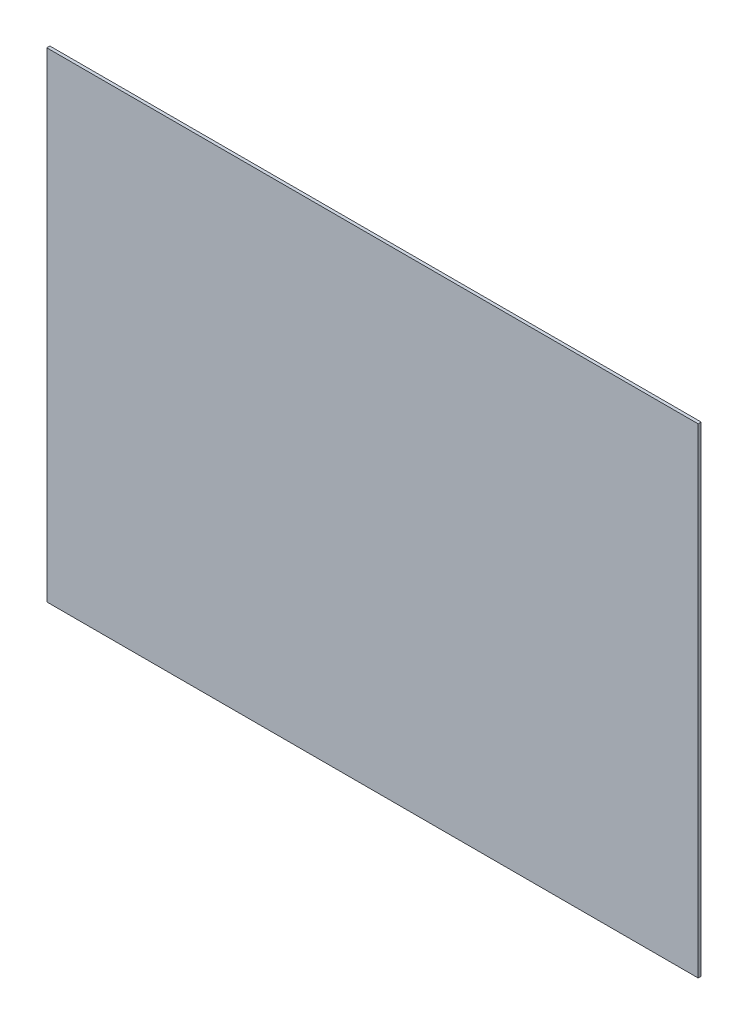
ISO-10303-21;
HEADER;
FILE_DESCRIPTION(('STEP AP214'),'2;1');
FILE_NAME('part.step','',(''),(''),'','','');
FILE_SCHEMA(('AUTOMOTIVE_DESIGN { 1 0 10303 214 1 1 1 1 }'));
ENDSEC;
DATA;
#1=APPLICATION_CONTEXT('core data for automotive mechanical design processes');
#2=APPLICATION_PROTOCOL_DEFINITION('international standard','automotive_design',2000,#1);
#3=PRODUCT_CONTEXT('',#1,'mechanical');
#4=PRODUCT('Part','Part','',(#3));
#5=PRODUCT_RELATED_PRODUCT_CATEGORY('part','',(#4));
#6=PRODUCT_DEFINITION_FORMATION('','',#4);
#7=PRODUCT_DEFINITION_CONTEXT('part definition',#1,'design');
#8=PRODUCT_DEFINITION('design','',#6,#7);
#9=PRODUCT_DEFINITION_SHAPE('','',#8);
#10=(LENGTH_UNIT() NAMED_UNIT(*) SI_UNIT(.MILLI.,.METRE.));
#11=(NAMED_UNIT(*) PLANE_ANGLE_UNIT() SI_UNIT($,.RADIAN.));
#12=(NAMED_UNIT(*) SI_UNIT($,.STERADIAN.) SOLID_ANGLE_UNIT());
#13=UNCERTAINTY_MEASURE_WITH_UNIT(LENGTH_MEASURE(1.E-05),#10,'distance_accuracy_value','');
#14=(GEOMETRIC_REPRESENTATION_CONTEXT(3) GLOBAL_UNCERTAINTY_ASSIGNED_CONTEXT((#13)) GLOBAL_UNIT_ASSIGNED_CONTEXT((#10,
#11,#12)) REPRESENTATION_CONTEXT('',''));
#15=CARTESIAN_POINT('',(0.,0.,0.));
#16=DIRECTION('',(0.,0.,1.));
#17=DIRECTION('',(1.,0.,0.));
#18=AXIS2_PLACEMENT_3D('',#15,#16,#17);
#19=CARTESIAN_POINT('',(1900.,-1400.,18.));
#20=DIRECTION('',(-1.,0.,0.));
#21=DIRECTION('',(0.,0.,1.));
#22=AXIS2_PLACEMENT_3D('',#19,#20,#21);
#23=PLANE('',#22);
#24=DIRECTION('',(0.,1.,0.));
#25=VECTOR('',#24,1.);
#26=CARTESIAN_POINT('',(1900.,-1400.,0.));
#27=LINE('',#26,#25);
#28=CARTESIAN_POINT('',(1900.,-1400.,0.));
#29=VERTEX_POINT('',#28);
#30=CARTESIAN_POINT('',(1900.,1400.,0.));
#31=VERTEX_POINT('',#30);
#32=EDGE_CURVE('E100',#29,#31,#27,.T.);
#33=ORIENTED_EDGE('',*,*,#32,.T.);
#34=DIRECTION('',(0.,0.,-1.));
#35=VECTOR('',#34,1.);
#36=CARTESIAN_POINT('',(1900.,1400.,18.));
#37=LINE('',#36,#35);
#38=CARTESIAN_POINT('',(1900.,1400.,18.));
#39=VERTEX_POINT('',#38);
#40=EDGE_CURVE('E11',#39,#31,#37,.T.);
#41=ORIENTED_EDGE('',*,*,#40,.F.);
#42=DIRECTION('',(0.,1.,0.));
#43=VECTOR('',#42,1.);
#44=CARTESIAN_POINT('',(1900.,-1400.,18.));
#45=LINE('',#44,#43);
#46=CARTESIAN_POINT('',(1900.,-1400.,18.));
#47=VERTEX_POINT('',#46);
#48=EDGE_CURVE('E88',#47,#39,#45,.T.);
#49=ORIENTED_EDGE('',*,*,#48,.F.);
#50=DIRECTION('',(0.,0.,-1.));
#51=VECTOR('',#50,1.);
#52=CARTESIAN_POINT('',(1900.,-1400.,18.));
#53=LINE('',#52,#51);
#54=EDGE_CURVE('E96',#47,#29,#53,.T.);
#55=ORIENTED_EDGE('',*,*,#54,.T.);
#56=EDGE_LOOP('',(#33,#41,#49,#55));
#57=FACE_BOUND('',#56,.T.);
#58=ADVANCED_FACE('F37',(#57),#23,.F.);
#59=CARTESIAN_POINT('',(-1900.,1400.,18.));
#60=DIRECTION('',(0.,-1.,0.));
#61=DIRECTION('',(0.,0.,-1.));
#62=AXIS2_PLACEMENT_3D('',#59,#60,#61);
#63=PLANE('',#62);
#64=DIRECTION('',(-1.,0.,0.));
#65=VECTOR('',#64,1.);
#66=CARTESIAN_POINT('',(-1900.,1400.,0.));
#67=LINE('',#66,#65);
#68=CARTESIAN_POINT('',(-1900.,1400.,0.));
#69=VERTEX_POINT('',#68);
#70=EDGE_CURVE('E92',#31,#69,#67,.T.);
#71=ORIENTED_EDGE('',*,*,#70,.T.);
#72=DIRECTION('',(0.,0.,-1.));
#73=VECTOR('',#72,1.);
#74=CARTESIAN_POINT('',(-1900.,1400.,18.));
#75=LINE('',#74,#73);
#76=CARTESIAN_POINT('',(-1900.,1400.,18.));
#77=VERTEX_POINT('',#76);
#78=EDGE_CURVE('E45',#77,#69,#75,.T.);
#79=ORIENTED_EDGE('',*,*,#78,.F.);
#80=DIRECTION('',(-1.,0.,0.));
#81=VECTOR('',#80,1.);
#82=CARTESIAN_POINT('',(-1900.,1400.,18.));
#83=LINE('',#82,#81);
#84=EDGE_CURVE('E83',#39,#77,#83,.T.);
#85=ORIENTED_EDGE('',*,*,#84,.F.);
#86=ORIENTED_EDGE('',*,*,#40,.T.);
#87=EDGE_LOOP('',(#71,#79,#85,#86));
#88=FACE_BOUND('',#87,.T.);
#89=ADVANCED_FACE('F91',(#88),#63,.F.);
#90=CARTESIAN_POINT('',(-1900.,-1400.,18.));
#91=DIRECTION('',(1.,0.,0.));
#92=DIRECTION('',(0.,0.,-1.));
#93=AXIS2_PLACEMENT_3D('',#90,#91,#92);
#94=PLANE('',#93);
#95=DIRECTION('',(0.,-1.,0.));
#96=VECTOR('',#95,1.);
#97=CARTESIAN_POINT('',(-1900.,-1400.,0.));
#98=LINE('',#97,#96);
#99=CARTESIAN_POINT('',(-1900.,-1400.,0.));
#100=VERTEX_POINT('',#99);
#101=EDGE_CURVE('E70',#69,#100,#98,.T.);
#102=ORIENTED_EDGE('',*,*,#101,.T.);
#103=DIRECTION('',(0.,0.,-1.));
#104=VECTOR('',#103,1.);
#105=CARTESIAN_POINT('',(-1900.,-1400.,18.));
#106=LINE('',#105,#104);
#107=CARTESIAN_POINT('',(-1900.,-1400.,18.));
#108=VERTEX_POINT('',#107);
#109=EDGE_CURVE('E93',#108,#100,#106,.T.);
#110=ORIENTED_EDGE('',*,*,#109,.F.);
#111=DIRECTION('',(0.,-1.,0.));
#112=VECTOR('',#111,1.);
#113=CARTESIAN_POINT('',(-1900.,-1400.,18.));
#114=LINE('',#113,#112);
#115=EDGE_CURVE('E86',#77,#108,#114,.T.);
#116=ORIENTED_EDGE('',*,*,#115,.F.);
#117=ORIENTED_EDGE('',*,*,#78,.T.);
#118=EDGE_LOOP('',(#102,#110,#116,#117));
#119=FACE_BOUND('',#118,.T.);
#120=ADVANCED_FACE('F94',(#119),#94,.F.);
#121=CARTESIAN_POINT('',(-1900.,-1400.,18.));
#122=DIRECTION('',(0.,1.,0.));
#123=DIRECTION('',(0.,0.,1.));
#124=AXIS2_PLACEMENT_3D('',#121,#122,#123);
#125=PLANE('',#124);
#126=DIRECTION('',(1.,0.,0.));
#127=VECTOR('',#126,1.);
#128=CARTESIAN_POINT('',(-1900.,-1400.,0.));
#129=LINE('',#128,#127);
#130=EDGE_CURVE('E76',#100,#29,#129,.T.);
#131=ORIENTED_EDGE('',*,*,#130,.T.);
#132=ORIENTED_EDGE('',*,*,#54,.F.);
#133=DIRECTION('',(1.,0.,0.));
#134=VECTOR('',#133,1.);
#135=CARTESIAN_POINT('',(-1900.,-1400.,18.));
#136=LINE('',#135,#134);
#137=EDGE_CURVE('E53',#108,#47,#136,.T.);
#138=ORIENTED_EDGE('',*,*,#137,.F.);
#139=ORIENTED_EDGE('',*,*,#109,.T.);
#140=EDGE_LOOP('',(#131,#132,#138,#139));
#141=FACE_BOUND('',#140,.T.);
#142=ADVANCED_FACE('F107',(#141),#125,.F.);
#143=CARTESIAN_POINT('',(0.,0.,18.));
#144=DIRECTION('',(0.,0.,-1.));
#145=DIRECTION('',(-1.,0.,0.));
#146=AXIS2_PLACEMENT_3D('',#143,#144,#145);
#147=PLANE('',#146);
#148=ORIENTED_EDGE('',*,*,#48,.T.);
#149=ORIENTED_EDGE('',*,*,#84,.T.);
#150=ORIENTED_EDGE('',*,*,#115,.T.);
#151=ORIENTED_EDGE('',*,*,#137,.T.);
#152=EDGE_LOOP('',(#148,#149,#150,#151));
#153=FACE_BOUND('',#152,.T.);
#154=ADVANCED_FACE('F84',(#153),#147,.F.);
#155=CARTESIAN_POINT('',(0.,0.,0.));
#156=DIRECTION('',(0.,0.,-1.));
#157=DIRECTION('',(-1.,0.,0.));
#158=AXIS2_PLACEMENT_3D('',#155,#156,#157);
#159=PLANE('',#158);
#160=ORIENTED_EDGE('',*,*,#32,.F.);
#161=ORIENTED_EDGE('',*,*,#130,.F.);
#162=ORIENTED_EDGE('',*,*,#101,.F.);
#163=ORIENTED_EDGE('',*,*,#70,.F.);
#164=EDGE_LOOP('',(#160,#161,#162,#163));
#165=FACE_BOUND('',#164,.T.);
#166=ADVANCED_FACE('F110',(#165),#159,.T.);
#167=CLOSED_SHELL('',(#58,#89,#120,#142,#154,#166));
#168=MANIFOLD_SOLID_BREP('B2',#167);
#169=ADVANCED_BREP_SHAPE_REPRESENTATION('',(#18,#168),#14);
#170=SHAPE_DEFINITION_REPRESENTATION(#9,#169);
ENDSEC;
END-ISO-10303-21;
